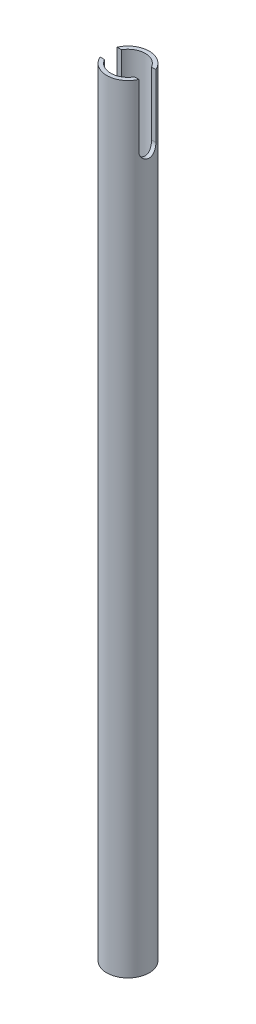
ISO-10303-21;
HEADER;
FILE_DESCRIPTION(('STEP AP214'),'2;1');
FILE_NAME('part.step','',(''),(''),'','','');
FILE_SCHEMA(('AUTOMOTIVE_DESIGN { 1 0 10303 214 1 1 1 1 }'));
ENDSEC;
DATA;
#1=APPLICATION_CONTEXT('core data for automotive mechanical design processes');
#2=APPLICATION_PROTOCOL_DEFINITION('international standard','automotive_design',2000,#1);
#3=PRODUCT_CONTEXT('',#1,'mechanical');
#4=PRODUCT('Part','Part','',(#3));
#5=PRODUCT_RELATED_PRODUCT_CATEGORY('part','',(#4));
#6=PRODUCT_DEFINITION_FORMATION('','',#4);
#7=PRODUCT_DEFINITION_CONTEXT('part definition',#1,'design');
#8=PRODUCT_DEFINITION('design','',#6,#7);
#9=PRODUCT_DEFINITION_SHAPE('','',#8);
#10=(LENGTH_UNIT() NAMED_UNIT(*) SI_UNIT(.MILLI.,.METRE.));
#11=(NAMED_UNIT(*) PLANE_ANGLE_UNIT() SI_UNIT($,.RADIAN.));
#12=(NAMED_UNIT(*) SI_UNIT($,.STERADIAN.) SOLID_ANGLE_UNIT());
#13=UNCERTAINTY_MEASURE_WITH_UNIT(LENGTH_MEASURE(1.E-05),#10,'distance_accuracy_value','');
#14=(GEOMETRIC_REPRESENTATION_CONTEXT(3) GLOBAL_UNCERTAINTY_ASSIGNED_CONTEXT((#13)) GLOBAL_UNIT_ASSIGNED_CONTEXT((#10,
#11,#12)) REPRESENTATION_CONTEXT('',''));
#15=CARTESIAN_POINT('',(0.,0.,0.));
#16=DIRECTION('',(0.,0.,1.));
#17=DIRECTION('',(1.,0.,0.));
#18=AXIS2_PLACEMENT_3D('',#15,#16,#17);
#19=CARTESIAN_POINT('',(0.,291.329005832087,3.17499999999999));
#20=DIRECTION('',(0.,1.,0.));
#21=DIRECTION('',(-1.,0.,0.));
#22=AXIS2_PLACEMENT_3D('',#19,#20,#21);
#23=PLANE('',#22);
#24=DIRECTION('',(-1.,0.,0.));
#25=VECTOR('',#24,1.);
#26=CARTESIAN_POINT('',(0.,291.329005832087,-3.17499999999999));
#27=LINE('',#26,#25);
#28=CARTESIAN_POINT('',(7.2748389157424,291.329005832087,-3.17499999999999));
#29=VERTEX_POINT('',#28);
#30=CARTESIAN_POINT('',(5.63085690548073,291.329005832087,-3.17499999999999));
#31=VERTEX_POINT('',#30);
#32=EDGE_CURVE('E170',#29,#31,#27,.T.);
#33=ORIENTED_EDGE('',*,*,#32,.F.);
#34=CARTESIAN_POINT('',(0.,291.329005832087,0.));
#35=DIRECTION('',(0.,1.,0.));
#36=DIRECTION('',(-1.,0.,0.));
#37=AXIS2_PLACEMENT_3D('',#34,#35,#36);
#38=CIRCLE('',#37,7.9375);
#39=CARTESIAN_POINT('',(-7.2748389157424,291.329005832087,-3.17499999999999));
#40=VERTEX_POINT('',#39);
#41=EDGE_CURVE('E211',#29,#40,#38,.T.);
#42=ORIENTED_EDGE('',*,*,#41,.T.);
#43=CARTESIAN_POINT('',(-5.63085690548073,291.329005832087,-3.17499999999999));
#44=VERTEX_POINT('',#43);
#45=EDGE_CURVE('E171',#44,#40,#27,.T.);
#46=ORIENTED_EDGE('',*,*,#45,.F.);
#47=CARTESIAN_POINT('',(0.,291.329005832087,0.));
#48=DIRECTION('',(0.,1.,0.));
#49=DIRECTION('',(-1.,0.,0.));
#50=AXIS2_PLACEMENT_3D('',#47,#48,#49);
#51=CIRCLE('',#50,6.4643);
#52=EDGE_CURVE('E207',#31,#44,#51,.T.);
#53=ORIENTED_EDGE('',*,*,#52,.F.);
#54=EDGE_LOOP('',(#33,#42,#46,#53));
#55=FACE_BOUND('',#54,.T.);
#56=ADVANCED_FACE('F36',(#55),#23,.T.);
#57=CARTESIAN_POINT('',(0.,339.17964613476,0.));
#58=DIRECTION('',(0.,-1.,0.));
#59=DIRECTION('',(0.,0.,-1.));
#60=AXIS2_PLACEMENT_3D('',#57,#58,#59);
#61=CYLINDRICAL_SURFACE('',#60,7.9375);
#62=CARTESIAN_POINT('',(0.,0.,0.));
#63=DIRECTION('',(0.,1.,0.));
#64=DIRECTION('',(0.,0.,1.));
#65=AXIS2_PLACEMENT_3D('',#62,#63,#64);
#66=CIRCLE('',#65,7.9375);
#67=CARTESIAN_POINT('',(0.,0.,7.9375));
#68=VERTEX_POINT('',#67);
#69=EDGE_CURVE('E208',#68,#68,#66,.T.);
#70=ORIENTED_EDGE('',*,*,#69,.T.);
#71=EDGE_LOOP('',(#70));
#72=FACE_BOUND('',#71,.T.);
#73=ORIENTED_EDGE('',*,*,#41,.F.);
#74=DIRECTION('',(0.,-1.,0.));
#75=VECTOR('',#74,1.);
#76=CARTESIAN_POINT('',(7.2748389157424,339.17964613476,-3.17499999999998));
#77=LINE('',#76,#75);
#78=CARTESIAN_POINT('',(7.2748389157424,267.691978033004,-3.175));
#79=VERTEX_POINT('',#78);
#80=EDGE_CURVE('E119',#29,#79,#77,.T.);
#81=ORIENTED_EDGE('',*,*,#80,.T.);
#82=CARTESIAN_POINT('',(7.2748389157424,267.691978033004,-3.175));
#83=CARTESIAN_POINT('',(7.27482137346731,267.606561242157,-3.17501266882701));
#84=CARTESIAN_POINT('',(7.2763428589775,267.521154038932,-3.17155340043564));
#85=CARTESIAN_POINT('',(7.2823328035035,267.351028597025,-3.15779000732846));
#86=CARTESIAN_POINT('',(7.28680014012066,267.266310108377,-3.14748848956708));
#87=CARTESIAN_POINT('',(7.29852780386515,267.09849620378,-3.12019320836237));
#88=CARTESIAN_POINT('',(7.30577708764083,267.015395718335,-3.10322589952438));
#89=CARTESIAN_POINT('',(7.32282084608483,266.851078057908,-3.06278962927674));
#90=CARTESIAN_POINT('',(7.3326154761132,266.769860998214,-3.03932027099634));
#91=CARTESIAN_POINT('',(7.36535374856868,266.530029870206,-2.95952817722212));
#92=CARTESIAN_POINT('',(7.39167700537415,266.374901941786,-2.89376627017734));
#93=CARTESIAN_POINT('',(7.45033388590046,266.077815049622,-2.7392025415261));
#94=CARTESIAN_POINT('',(7.48267321509131,265.935868780172,-2.65037881684982));
#95=CARTESIAN_POINT('',(7.55175336550835,265.66114897829,-2.4468428923214));
#96=CARTESIAN_POINT('',(7.588634899463,265.529220076165,-2.3310360096301));
#97=CARTESIAN_POINT('',(7.66147804996073,265.286057850849,-2.07914313305182));
#98=CARTESIAN_POINT('',(7.69743947634239,265.174828776426,-1.94305298619927));
#99=CARTESIAN_POINT('',(7.76610424655587,264.971945382301,-1.64783437907487));
#100=CARTESIAN_POINT('',(7.79862271461643,264.881238148614,-1.48800809365191));
#101=CARTESIAN_POINT('',(7.85501261299655,264.728363067298,-1.15383332747063));
#102=CARTESIAN_POINT('',(7.87888765130921,264.666183308653,-0.979490943577508));
#103=CARTESIAN_POINT('',(7.91429574508624,264.575173877037,-0.630185812820644));
#104=CARTESIAN_POINT('',(7.92637039529115,264.544875252503,-0.455661798193267));
#105=CARTESIAN_POINT('',(7.93877492459936,264.513757817031,-0.103613634211566));
#106=CARTESIAN_POINT('',(7.93910896442721,264.512928562519,0.0739094300030551));
#107=CARTESIAN_POINT('',(7.92832361516669,264.539969554444,0.416295487790175));
#108=CARTESIAN_POINT('',(7.91784651916131,264.566230346474,0.581309494992118));
#109=CARTESIAN_POINT('',(7.88748217026596,264.643967546574,0.904358712556958));
#110=CARTESIAN_POINT('',(7.86759438481231,264.695445381718,1.06239352740443));
#111=CARTESIAN_POINT('',(7.81997467816327,264.822788349732,1.36984988491622));
#112=CARTESIAN_POINT('',(7.7921290207194,264.899009439867,1.51910565802055));
#113=CARTESIAN_POINT('',(7.73135683541739,265.073339830064,1.80309420082015));
#114=CARTESIAN_POINT('',(7.69842852631223,265.17145680907,1.93782185081833));
#115=CARTESIAN_POINT('',(7.62828318752464,265.394303603316,2.19831250886755));
#116=CARTESIAN_POINT('',(7.59092651959626,265.520356745791,2.32290812422053));
#117=CARTESIAN_POINT('',(7.51779639956166,265.791697644384,2.54968017957911));
#118=CARTESIAN_POINT('',(7.48202367463434,265.9369941153,2.6518464058569));
#119=CARTESIAN_POINT('',(7.41514238501918,266.248143055038,2.83359604410578));
#120=CARTESIAN_POINT('',(7.38419755733311,266.414466546503,2.9124454400729));
#121=CARTESIAN_POINT('',(7.34535742834898,266.67300741989,3.00845526999255));
#122=CARTESIAN_POINT('',(7.3336755200429,266.760674228114,3.03674359852997));
#123=CARTESIAN_POINT('',(7.31322917691504,266.938439942827,3.08565852812915));
#124=CARTESIAN_POINT('',(7.30446343423192,267.028537739398,3.10628856431505));
#125=CARTESIAN_POINT('',(7.28994070197192,267.213702191436,3.14023004946565));
#126=CARTESIAN_POINT('',(7.2843027635288,267.30883121696,3.15325280299648));
#127=CARTESIAN_POINT('',(7.27673901487912,267.499961791552,3.17064531592315));
#128=CARTESIAN_POINT('',(7.2748109173123,267.595962766292,3.17502040721544));
#129=CARTESIAN_POINT('',(7.2748389157424,267.691978033004,3.175));
#130=B_SPLINE_CURVE_WITH_KNOTS('',3,(#82,#83,#84,#85,#86,#87,#88,#89,#90,#91,#92,#93,#94,#95,
#96,#97,#98,#99,#100,#101,#102,#103,#104,#105,#106,#107,#108,#109,#110,#111,#112,#113,#114,#115,
#116,#117,#118,#119,#120,#121,#122,#123,#124,#125,#126,#127,#128,#129),.UNSPECIFIED.,.F.,.F.,(4,
2,2,2,2,2,2,2,2,2,2,2,2,2,2,2,2,2,2,2,2,2,2,4),(0.,0.256150829294387,0.512204118914552,
0.767251309112325,1.02231407025902,1.53143426526075,2.04103977971416,2.57679901192849,
3.11266809105968,3.66971038544649,4.22651988700745,4.75637028950525,5.28603291779512,
5.78594402974508,6.28588343572724,6.79335980872481,7.30101443548666,7.8419622604596,
8.383155909604,8.93991483457339,9.21815697205879,9.49627415290111,9.78435582473146,
10.072259818324),.UNSPECIFIED.);
#131=CARTESIAN_POINT('',(7.27483891574239,267.691978033004,3.175));
#132=VERTEX_POINT('',#131);
#133=EDGE_CURVE('E118',#79,#132,#130,.T.);
#134=ORIENTED_EDGE('',*,*,#133,.T.);
#135=DIRECTION('',(0.,-1.,0.));
#136=VECTOR('',#135,1.);
#137=CARTESIAN_POINT('',(7.27483891574239,339.17964613476,3.17500000000002));
#138=LINE('',#137,#136);
#139=CARTESIAN_POINT('',(7.2748389157424,291.329005832087,3.17499999999999));
#140=VERTEX_POINT('',#139);
#141=EDGE_CURVE('E136',#132,#140,#138,.F.);
#142=ORIENTED_EDGE('',*,*,#141,.T.);
#143=CARTESIAN_POINT('',(-7.2748389157424,291.329005832087,3.17499999999999));
#144=VERTEX_POINT('',#143);
#145=EDGE_CURVE('E131',#144,#140,#38,.T.);
#146=ORIENTED_EDGE('',*,*,#145,.F.);
#147=DIRECTION('',(0.,-1.,0.));
#148=VECTOR('',#147,1.);
#149=CARTESIAN_POINT('',(-7.27483891574239,339.17964613476,3.17500000000002));
#150=LINE('',#149,#148);
#151=CARTESIAN_POINT('',(-7.27483891574239,267.691978033004,3.175));
#152=VERTEX_POINT('',#151);
#153=EDGE_CURVE('E58',#144,#152,#150,.T.);
#154=ORIENTED_EDGE('',*,*,#153,.T.);
#155=CARTESIAN_POINT('',(-7.2748389157424,267.691978033004,3.175));
#156=CARTESIAN_POINT('',(-7.2748213734673,267.606561242157,3.17501266882702));
#157=CARTESIAN_POINT('',(-7.2763428589775,267.521154038932,3.17155340043565));
#158=CARTESIAN_POINT('',(-7.2823328035035,267.351028597025,3.15779000732847));
#159=CARTESIAN_POINT('',(-7.28680014012065,267.266310108377,3.14748848956709));
#160=CARTESIAN_POINT('',(-7.29852780386515,267.09849620378,3.12019320836238));
#161=CARTESIAN_POINT('',(-7.30577708764083,267.015395718335,3.10322589952439));
#162=CARTESIAN_POINT('',(-7.32282084608482,266.851078057908,3.06278962927675));
#163=CARTESIAN_POINT('',(-7.3326154761132,266.769860998214,3.03932027099635));
#164=CARTESIAN_POINT('',(-7.36535374856867,266.530029870206,2.95952817722213));
#165=CARTESIAN_POINT('',(-7.39167700537415,266.374901941786,2.89376627017735));
#166=CARTESIAN_POINT('',(-7.45033388590046,266.077815049622,2.73920254152611));
#167=CARTESIAN_POINT('',(-7.48267321509131,265.935868780172,2.65037881684982));
#168=CARTESIAN_POINT('',(-7.55175336550835,265.66114897829,2.44684289232139));
#169=CARTESIAN_POINT('',(-7.588634899463,265.529220076165,2.3310360096301));
#170=CARTESIAN_POINT('',(-7.66147804996073,265.286057850849,2.07914313305181));
#171=CARTESIAN_POINT('',(-7.69743947634239,265.174828776426,1.94305298619926));
#172=CARTESIAN_POINT('',(-7.76610424655587,264.971945382301,1.64783437907488));
#173=CARTESIAN_POINT('',(-7.79862271461643,264.881238148614,1.48800809365192));
#174=CARTESIAN_POINT('',(-7.85501261299655,264.728363067298,1.15383332747064));
#175=CARTESIAN_POINT('',(-7.8788876513092,264.666183308653,0.979490943577513));
#176=CARTESIAN_POINT('',(-7.91429574508624,264.575173877037,0.630185812820647));
#177=CARTESIAN_POINT('',(-7.92637039529115,264.544875252503,0.455661798193267));
#178=CARTESIAN_POINT('',(-7.93877492459936,264.513757817031,0.103613634211562));
#179=CARTESIAN_POINT('',(-7.93910896442721,264.512928562519,-0.0739094300030618));
#180=CARTESIAN_POINT('',(-7.92832361516669,264.539969554444,-0.416295487790186));
#181=CARTESIAN_POINT('',(-7.91784651916131,264.566230346474,-0.581309494992131));
#182=CARTESIAN_POINT('',(-7.88748217026596,264.643967546574,-0.904358712556966));
#183=CARTESIAN_POINT('',(-7.86759438481231,264.695445381718,-1.06239352740444));
#184=CARTESIAN_POINT('',(-7.81997467816328,264.822788349732,-1.36984988491622));
#185=CARTESIAN_POINT('',(-7.7921290207194,264.899009439867,-1.51910565802054));
#186=CARTESIAN_POINT('',(-7.73135683541739,265.073339830064,-1.80309420082014));
#187=CARTESIAN_POINT('',(-7.69842852631223,265.17145680907,-1.93782185081832));
#188=CARTESIAN_POINT('',(-7.62828318752464,265.394303603316,-2.19831250886755));
#189=CARTESIAN_POINT('',(-7.59092651959626,265.520356745791,-2.32290812422053));
#190=CARTESIAN_POINT('',(-7.51779639956166,265.791697644384,-2.5496801795791));
#191=CARTESIAN_POINT('',(-7.48202367463434,265.9369941153,-2.6518464058569));
#192=CARTESIAN_POINT('',(-7.41514238501918,266.248143055038,-2.83359604410577));
#193=CARTESIAN_POINT('',(-7.38419755733311,266.414466546503,-2.9124454400729));
#194=CARTESIAN_POINT('',(-7.34535742834898,266.67300741989,-3.00845526999254));
#195=CARTESIAN_POINT('',(-7.3336755200429,266.760674228114,-3.03674359852997));
#196=CARTESIAN_POINT('',(-7.31322917691504,266.938439942827,-3.08565852812915));
#197=CARTESIAN_POINT('',(-7.30446343423192,267.028537739398,-3.10628856431504));
#198=CARTESIAN_POINT('',(-7.28994070197193,267.213702191436,-3.14023004946564));
#199=CARTESIAN_POINT('',(-7.2843027635288,267.30883121696,-3.15325280299647));
#200=CARTESIAN_POINT('',(-7.27673901487912,267.499961791552,-3.17064531592314));
#201=CARTESIAN_POINT('',(-7.2748109173123,267.595962766292,-3.17502040721544));
#202=CARTESIAN_POINT('',(-7.2748389157424,267.691978033004,-3.175));
#203=B_SPLINE_CURVE_WITH_KNOTS('',3,(#155,#156,#157,#158,#159,#160,#161,#162,#163,#164,#165,
#166,#167,#168,#169,#170,#171,#172,#173,#174,#175,#176,#177,#178,#179,#180,#181,#182,#183,#184,
#185,#186,#187,#188,#189,#190,#191,#192,#193,#194,#195,#196,#197,#198,#199,#200,#201,#202),
.UNSPECIFIED.,.F.,.F.,(4,2,2,2,2,2,2,2,2,2,2,2,2,2,2,2,2,2,2,2,2,2,2,4),(0.,0.256150829294387,
0.512204118914552,0.767251309112325,1.02231407025902,1.53143426526075,2.04103977971416,
2.57679901192855,3.11266809105968,3.66971038544649,4.22651988700746,4.75637028950526,
5.28603291779514,5.78594402974511,6.28588343572724,6.79335980872481,7.30101443548666,
7.8419622604596,8.383155909604,8.93991483457339,9.21815697205879,9.49627415290111,
9.78435582473146,10.072259818324),.UNSPECIFIED.);
#204=CARTESIAN_POINT('',(-7.2748389157424,267.691978033004,-3.175));
#205=VERTEX_POINT('',#204);
#206=EDGE_CURVE('E109',#152,#205,#203,.T.);
#207=ORIENTED_EDGE('',*,*,#206,.T.);
#208=DIRECTION('',(0.,-1.,0.));
#209=VECTOR('',#208,1.);
#210=CARTESIAN_POINT('',(-7.2748389157424,339.17964613476,-3.17499999999998));
#211=LINE('',#210,#209);
#212=EDGE_CURVE('E134',#205,#40,#211,.F.);
#213=ORIENTED_EDGE('',*,*,#212,.T.);
#214=EDGE_LOOP('',(#73,#81,#134,#142,#146,#154,#207,#213));
#215=FACE_BOUND('',#214,.T.);
#216=ADVANCED_FACE('F38',(#72,#215),#61,.T.);
#217=CARTESIAN_POINT('',(0.,0.,0.));
#218=DIRECTION('',(0.,1.,0.));
#219=DIRECTION('',(0.,0.,1.));
#220=AXIS2_PLACEMENT_3D('',#217,#218,#219);
#221=PLANE('',#220);
#222=ORIENTED_EDGE('',*,*,#69,.F.);
#223=EDGE_LOOP('',(#222));
#224=FACE_BOUND('',#223,.T.);
#225=CARTESIAN_POINT('',(0.,0.,0.));
#226=DIRECTION('',(0.,1.,0.));
#227=DIRECTION('',(0.,0.,1.));
#228=AXIS2_PLACEMENT_3D('',#225,#226,#227);
#229=CIRCLE('',#228,6.4643);
#230=CARTESIAN_POINT('',(0.,0.,6.4643));
#231=VERTEX_POINT('',#230);
#232=EDGE_CURVE('E206',#231,#231,#229,.T.);
#233=ORIENTED_EDGE('',*,*,#232,.T.);
#234=EDGE_LOOP('',(#233));
#235=FACE_BOUND('',#234,.T.);
#236=ADVANCED_FACE('F177',(#224,#235),#221,.F.);
#237=CARTESIAN_POINT('',(0.,339.17964613476,0.));
#238=DIRECTION('',(0.,-1.,0.));
#239=DIRECTION('',(0.,0.,-1.));
#240=AXIS2_PLACEMENT_3D('',#237,#238,#239);
#241=CYLINDRICAL_SURFACE('',#240,6.4643);
#242=DIRECTION('',(0.,-1.,0.));
#243=VECTOR('',#242,1.);
#244=CARTESIAN_POINT('',(-5.63085690548074,339.17964613476,-3.17499999999998));
#245=LINE('',#244,#243);
#246=CARTESIAN_POINT('',(-5.63085690548073,267.691978033004,-3.175));
#247=VERTEX_POINT('',#246);
#248=EDGE_CURVE('E132',#247,#44,#245,.F.);
#249=ORIENTED_EDGE('',*,*,#248,.F.);
#250=CARTESIAN_POINT('',(-5.63085690548073,267.691978033004,3.175));
#251=CARTESIAN_POINT('',(-5.63083314427865,267.608604688373,3.17501475658537));
#252=CARTESIAN_POINT('',(-5.63270800290612,267.525244504281,3.17171650894932));
#253=CARTESIAN_POINT('',(-5.64007619078876,267.359246244162,3.15861005673363));
#254=CARTESIAN_POINT('',(-5.64556738634361,267.276607771427,3.14880569084843));
#255=CARTESIAN_POINT('',(-5.65994981136479,267.113104282406,3.12287502503968));
#256=CARTESIAN_POINT('',(-5.66882198481542,267.032231964783,3.10678414485082));
#257=CARTESIAN_POINT('',(-5.68964152520503,266.872367708,3.06848950606601));
#258=CARTESIAN_POINT('',(-5.70158922758274,266.793375974976,3.04628508066559));
#259=CARTESIAN_POINT('',(-5.74141923049072,266.560311176745,2.97094683956398));
#260=CARTESIAN_POINT('',(-5.77333408209964,266.409671547362,2.9090108202004));
#261=CARTESIAN_POINT('',(-5.84425924105451,266.120816978303,2.76375069900003));
#262=CARTESIAN_POINT('',(-5.8832801090714,265.98262099491,2.68039468681891));
#263=CARTESIAN_POINT('',(-5.96775511660967,265.710680217436,2.48697633404428));
#264=CARTESIAN_POINT('',(-6.01347388807208,265.578143182901,2.37532770540396));
#265=CARTESIAN_POINT('',(-6.10404750316967,265.33276842569,2.13181920715592));
#266=CARTESIAN_POINT('',(-6.1489021156932,265.219935909491,1.99995401300493));
#267=CARTESIAN_POINT('',(-6.23617179606458,265.010002833209,1.70932187954952));
#268=CARTESIAN_POINT('',(-6.27824209999684,264.914389366207,1.54936740140359));
#269=CARTESIAN_POINT('',(-6.35176072116115,264.75198213415,1.21319061658813));
#270=CARTESIAN_POINT('',(-6.38321544776103,264.68517097234,1.03697820811137));
#271=CARTESIAN_POINT('',(-6.43004158193837,264.587044926957,0.686188092188342));
#272=CARTESIAN_POINT('',(-6.4463738522475,264.55359694204,0.512338218857005));
#273=CARTESIAN_POINT('',(-6.46469144763397,264.516136353527,0.160782019690507));
#274=CARTESIAN_POINT('',(-6.46668486855406,264.512107139809,-0.0169220731568658));
#275=CARTESIAN_POINT('',(-6.45656772214049,264.532742937696,-0.355165464690631));
#276=CARTESIAN_POINT('',(-6.44562758639317,264.555026548482,-0.515892945153654));
#277=CARTESIAN_POINT('',(-6.41262380355029,264.623413354821,-0.830980900255621));
#278=CARTESIAN_POINT('',(-6.39055953953696,264.66951787143,-0.985341021262242));
#279=CARTESIAN_POINT('',(-6.33694807701977,264.784577114457,-1.28605792480313));
#280=CARTESIAN_POINT('',(-6.30527071175889,264.853846915491,-1.43226999332137));
#281=CARTESIAN_POINT('',(-6.23531544865735,265.012854101295,-1.71135796541491));
#282=CARTESIAN_POINT('',(-6.19703506227319,265.102599206918,-1.84422881097799));
#283=CARTESIAN_POINT('',(-6.11334024943196,265.309515104003,-2.10589815284401));
#284=CARTESIAN_POINT('',(-6.06759349912715,265.428449140224,-2.23319819913489));
#285=CARTESIAN_POINT('',(-5.97642079952694,265.685602651658,-2.46684622430578));
#286=CARTESIAN_POINT('',(-5.93099515323759,265.823838302897,-2.57317644688652));
#287=CARTESIAN_POINT('',(-5.84266284464015,266.126041130414,-2.76814528378424));
#288=CARTESIAN_POINT('',(-5.80007313328349,266.291057149468,-2.85533090866606));
#289=CARTESIAN_POINT('',(-5.74498523796176,266.549433967913,-2.96377401450739));
#290=CARTESIAN_POINT('',(-5.72809486991884,266.637322455872,-2.99618869442095));
#291=CARTESIAN_POINT('',(-5.69788122082072,266.816159142456,-3.05325494421089));
#292=CARTESIAN_POINT('',(-5.68455638707004,266.90710598976,-3.07790989407045));
#293=CARTESIAN_POINT('',(-5.65951648210793,267.112223425745,-3.12376274190011));
#294=CARTESIAN_POINT('',(-5.64884707083827,267.226994391041,-3.14291763203007));
#295=CARTESIAN_POINT('',(-5.63809564796983,267.400547497552,-3.16213513069618));
#296=CARTESIAN_POINT('',(-5.63538722073203,267.458687370918,-3.16695519983111));
#297=CARTESIAN_POINT('',(-5.63176603795252,267.575205002151,-3.17338827752117));
#298=CARTESIAN_POINT('',(-5.63085344341391,267.633582780875,-3.17500099852573));
#299=CARTESIAN_POINT('',(-5.63085690548073,267.691978033004,-3.175));
#300=B_SPLINE_CURVE_WITH_KNOTS('',3,(#250,#251,#252,#253,#254,#255,#256,#257,#258,#259,#260,
#261,#262,#263,#264,#265,#266,#267,#268,#269,#270,#271,#272,#273,#274,#275,#276,#277,#278,#279,
#280,#281,#282,#283,#284,#285,#286,#287,#288,#289,#290,#291,#292,#293,#294,#295,#296,#297,#298,
#299),.UNSPECIFIED.,.F.,.F.,(4,2,2,2,2,2,2,2,2,2,2,2,2,2,2,2,2,2,2,2,2,2,2,2,4),(0.,
0.250012145988229,0.499876912554615,0.748353725112907,0.996857649784888,1.4924278441344,
1.98874063593385,2.52414179614751,3.05968421079767,3.62982161542683,4.19961416973237,
4.73004882970632,5.26018397799674,5.74579693142524,6.23143681875924,6.72397049630925,
7.2166902069248,7.75472587709895,8.29321519372077,8.86416763704419,9.14936329782647,
9.43443456060701,9.78397951274084,9.95908597830923,10.1342081421097),.UNSPECIFIED.);
#301=CARTESIAN_POINT('',(-5.63085690548072,267.691978033004,3.175));
#302=VERTEX_POINT('',#301);
#303=EDGE_CURVE('E12',#302,#247,#300,.T.);
#304=ORIENTED_EDGE('',*,*,#303,.F.);
#305=DIRECTION('',(0.,-1.,0.));
#306=VECTOR('',#305,1.);
#307=CARTESIAN_POINT('',(-5.63085690548072,339.17964613476,3.17500000000002));
#308=LINE('',#307,#306);
#309=CARTESIAN_POINT('',(-5.63085690548073,291.329005832087,3.17499999999999));
#310=VERTEX_POINT('',#309);
#311=EDGE_CURVE('E123',#310,#302,#308,.T.);
#312=ORIENTED_EDGE('',*,*,#311,.F.);
#313=CARTESIAN_POINT('',(5.63085690548073,291.329005832087,3.17499999999999));
#314=VERTEX_POINT('',#313);
#315=EDGE_CURVE('E202',#310,#314,#51,.T.);
#316=ORIENTED_EDGE('',*,*,#315,.T.);
#317=DIRECTION('',(0.,-1.,0.));
#318=VECTOR('',#317,1.);
#319=CARTESIAN_POINT('',(5.63085690548072,339.17964613476,3.17500000000002));
#320=LINE('',#319,#318);
#321=CARTESIAN_POINT('',(5.63085690548072,267.691978033004,3.175));
#322=VERTEX_POINT('',#321);
#323=EDGE_CURVE('E66',#322,#314,#320,.F.);
#324=ORIENTED_EDGE('',*,*,#323,.F.);
#325=CARTESIAN_POINT('',(5.63085690548073,267.691978033004,-3.175));
#326=CARTESIAN_POINT('',(5.63083314427865,267.608604688373,-3.17501475658537));
#327=CARTESIAN_POINT('',(5.63270800290613,267.525244504281,-3.17171650894932));
#328=CARTESIAN_POINT('',(5.64007619078876,267.359246244162,-3.15861005673362));
#329=CARTESIAN_POINT('',(5.64556738634361,267.276607771427,-3.14880569084842));
#330=CARTESIAN_POINT('',(5.65994981136479,267.113104282406,-3.12287502503967));
#331=CARTESIAN_POINT('',(5.66882198481542,267.032231964783,-3.10678414485081));
#332=CARTESIAN_POINT('',(5.68964152520503,266.872367708,-3.06848950606601));
#333=CARTESIAN_POINT('',(5.70158922758275,266.793375974976,-3.04628508066559));
#334=CARTESIAN_POINT('',(5.74141923049072,266.560311176745,-2.97094683956398));
#335=CARTESIAN_POINT('',(5.77333408209964,266.409671547362,-2.9090108202004));
#336=CARTESIAN_POINT('',(5.84425924105452,266.120816978303,-2.76375069900002));
#337=CARTESIAN_POINT('',(5.88328010907141,265.98262099491,-2.6803946868189));
#338=CARTESIAN_POINT('',(5.96775511660967,265.710680217436,-2.48697633404427));
#339=CARTESIAN_POINT('',(6.01347388807208,265.578143182901,-2.37532770540396));
#340=CARTESIAN_POINT('',(6.10404750316967,265.33276842569,-2.13181920715592));
#341=CARTESIAN_POINT('',(6.1489021156932,265.219935909491,-1.99995401300493));
#342=CARTESIAN_POINT('',(6.23617179606458,265.010002833209,-1.70932187954951));
#343=CARTESIAN_POINT('',(6.27824209999685,264.914389366207,-1.54936740140358));
#344=CARTESIAN_POINT('',(6.35176072116115,264.75198213415,-1.21319061658812));
#345=CARTESIAN_POINT('',(6.38321544776104,264.68517097234,-1.03697820811136));
#346=CARTESIAN_POINT('',(6.43004158193837,264.587044926957,-0.686188092188336));
#347=CARTESIAN_POINT('',(6.4463738522475,264.55359694204,-0.512338218857));
#348=CARTESIAN_POINT('',(6.46469144763397,264.516136353527,-0.160782019690502));
#349=CARTESIAN_POINT('',(6.46668486855406,264.512107139809,0.0169220731568713));
#350=CARTESIAN_POINT('',(6.45656772214049,264.532742937696,0.355165464690636));
#351=CARTESIAN_POINT('',(6.44562758639317,264.555026548482,0.51589294515366));
#352=CARTESIAN_POINT('',(6.41262380355029,264.623413354821,0.830980900255626));
#353=CARTESIAN_POINT('',(6.39055953953696,264.66951787143,0.985341021262247));
#354=CARTESIAN_POINT('',(6.33694807701977,264.784577114457,1.28605792480314));
#355=CARTESIAN_POINT('',(6.30527071175889,264.853846915491,1.43226999332138));
#356=CARTESIAN_POINT('',(6.23531544865734,265.012854101295,1.71135796541492));
#357=CARTESIAN_POINT('',(6.19703506227319,265.102599206918,1.844228810978));
#358=CARTESIAN_POINT('',(6.11334024943196,265.309515104003,2.10589815284401));
#359=CARTESIAN_POINT('',(6.06759349912715,265.428449140224,2.23319819913489));
#360=CARTESIAN_POINT('',(5.97642079952693,265.685602651658,2.46684622430579));
#361=CARTESIAN_POINT('',(5.93099515323759,265.823838302897,2.57317644688653));
#362=CARTESIAN_POINT('',(5.84266284464015,266.126041130414,2.76814528378424));
#363=CARTESIAN_POINT('',(5.80007313328348,266.291057149468,2.85533090866607));
#364=CARTESIAN_POINT('',(5.74498523796176,266.549433967913,2.96377401450739));
#365=CARTESIAN_POINT('',(5.72809486991883,266.637322455872,2.99618869442096));
#366=CARTESIAN_POINT('',(5.69788122082071,266.816159142456,3.0532549442109));
#367=CARTESIAN_POINT('',(5.68455638707004,266.90710598976,3.07790989407046));
#368=CARTESIAN_POINT('',(5.65951648210793,267.112223425745,3.12376274190011));
#369=CARTESIAN_POINT('',(5.64884707083826,267.226994391041,3.14291763203007));
#370=CARTESIAN_POINT('',(5.63809564796983,267.400547497552,3.16213513069618));
#371=CARTESIAN_POINT('',(5.63538722073202,267.458687370918,3.16695519983111));
#372=CARTESIAN_POINT('',(5.63176603795252,267.575205002151,3.17338827752118));
#373=CARTESIAN_POINT('',(5.63085344341391,267.633582780875,3.17500099852574));
#374=CARTESIAN_POINT('',(5.63085690548073,267.691978033004,3.175));
#375=B_SPLINE_CURVE_WITH_KNOTS('',3,(#325,#326,#327,#328,#329,#330,#331,#332,#333,#334,#335,
#336,#337,#338,#339,#340,#341,#342,#343,#344,#345,#346,#347,#348,#349,#350,#351,#352,#353,#354,
#355,#356,#357,#358,#359,#360,#361,#362,#363,#364,#365,#366,#367,#368,#369,#370,#371,#372,#373,
#374),.UNSPECIFIED.,.F.,.F.,(4,2,2,2,2,2,2,2,2,2,2,2,2,2,2,2,2,2,2,2,2,2,2,2,4),(0.,
0.250012145988229,0.499876912554615,0.748353725112907,0.996857649784888,1.4924278441344,
1.98874063593385,2.52414179614751,3.05968421079767,3.62982161542682,4.19961416973237,
4.73004882970632,5.26018397799673,5.74579693142524,6.23143681875924,6.72397049630925,
7.2166902069248,7.75472587709895,8.29321519372077,8.86416763704419,9.14936329782647,
9.434434560607,9.78397951274084,9.95908597830922,10.1342081421097),.UNSPECIFIED.);
#376=CARTESIAN_POINT('',(5.63085690548073,267.691978033004,-3.175));
#377=VERTEX_POINT('',#376);
#378=EDGE_CURVE('E51',#377,#322,#375,.T.);
#379=ORIENTED_EDGE('',*,*,#378,.F.);
#380=DIRECTION('',(0.,-1.,0.));
#381=VECTOR('',#380,1.);
#382=CARTESIAN_POINT('',(5.63085690548074,339.17964613476,-3.17499999999998));
#383=LINE('',#382,#381);
#384=EDGE_CURVE('E141',#31,#377,#383,.T.);
#385=ORIENTED_EDGE('',*,*,#384,.F.);
#386=ORIENTED_EDGE('',*,*,#52,.T.);
#387=EDGE_LOOP('',(#249,#304,#312,#316,#324,#379,#385,#386));
#388=FACE_BOUND('',#387,.T.);
#389=ORIENTED_EDGE('',*,*,#232,.F.);
#390=EDGE_LOOP('',(#389));
#391=FACE_BOUND('',#390,.T.);
#392=ADVANCED_FACE('F173',(#388,#391),#241,.F.);
#393=DIRECTION('',(1.,0.,0.));
#394=VECTOR('',#393,1.);
#395=CARTESIAN_POINT('',(0.,291.329005832087,3.17499999999999));
#396=LINE('',#395,#394);
#397=EDGE_CURVE('E200',#144,#310,#396,.T.);
#398=ORIENTED_EDGE('',*,*,#397,.F.);
#399=ORIENTED_EDGE('',*,*,#145,.T.);
#400=EDGE_CURVE('E203',#314,#140,#396,.T.);
#401=ORIENTED_EDGE('',*,*,#400,.F.);
#402=ORIENTED_EDGE('',*,*,#315,.F.);
#403=EDGE_LOOP('',(#398,#399,#401,#402));
#404=FACE_BOUND('',#403,.T.);
#405=ADVANCED_FACE('F176',(#404),#23,.T.);
#406=CARTESIAN_POINT('',(-7.9375,318.491978033004,3.17500000000001));
#407=DIRECTION('',(0.,0.,1.));
#408=DIRECTION('',(0.,-1.,0.));
#409=AXIS2_PLACEMENT_3D('',#406,#407,#408);
#410=PLANE('',#409);
#411=DIRECTION('',(1.,0.,0.));
#412=VECTOR('',#411,1.);
#413=CARTESIAN_POINT('',(-7.9375,267.691978033004,3.175));
#414=LINE('',#413,#412);
#415=EDGE_CURVE('E125',#322,#132,#414,.T.);
#416=ORIENTED_EDGE('',*,*,#415,.F.);
#417=ORIENTED_EDGE('',*,*,#323,.T.);
#418=ORIENTED_EDGE('',*,*,#400,.T.);
#419=ORIENTED_EDGE('',*,*,#141,.F.);
#420=EDGE_LOOP('',(#416,#417,#418,#419));
#421=FACE_BOUND('',#420,.T.);
#422=ADVANCED_FACE('F194',(#421),#410,.F.);
#423=CARTESIAN_POINT('',(-7.9375,318.491978033004,-3.17499999999999));
#424=DIRECTION('',(0.,0.,-1.));
#425=DIRECTION('',(0.,1.,0.));
#426=AXIS2_PLACEMENT_3D('',#423,#424,#425);
#427=PLANE('',#426);
#428=ORIENTED_EDGE('',*,*,#32,.T.);
#429=ORIENTED_EDGE('',*,*,#384,.T.);
#430=DIRECTION('',(1.,0.,0.));
#431=VECTOR('',#430,1.);
#432=CARTESIAN_POINT('',(-7.9375,267.691978033004,-3.175));
#433=LINE('',#432,#431);
#434=EDGE_CURVE('E124',#377,#79,#433,.T.);
#435=ORIENTED_EDGE('',*,*,#434,.T.);
#436=ORIENTED_EDGE('',*,*,#80,.F.);
#437=EDGE_LOOP('',(#428,#429,#435,#436));
#438=FACE_BOUND('',#437,.T.);
#439=ADVANCED_FACE('F159',(#438),#427,.F.);
#440=CARTESIAN_POINT('',(-7.9375,267.691978033004,0.));
#441=DIRECTION('',(1.,0.,0.));
#442=DIRECTION('',(0.,0.,-1.));
#443=AXIS2_PLACEMENT_3D('',#440,#441,#442);
#444=CYLINDRICAL_SURFACE('',#443,3.175);
#445=ORIENTED_EDGE('',*,*,#434,.F.);
#446=ORIENTED_EDGE('',*,*,#378,.T.);
#447=ORIENTED_EDGE('',*,*,#415,.T.);
#448=ORIENTED_EDGE('',*,*,#133,.F.);
#449=EDGE_LOOP('',(#445,#446,#447,#448));
#450=FACE_BOUND('',#449,.T.);
#451=ADVANCED_FACE('F154',(#450),#444,.F.);
#452=EDGE_CURVE('E111',#152,#302,#414,.T.);
#453=ORIENTED_EDGE('',*,*,#452,.T.);
#454=ORIENTED_EDGE('',*,*,#303,.T.);
#455=EDGE_CURVE('E114',#205,#247,#433,.T.);
#456=ORIENTED_EDGE('',*,*,#455,.F.);
#457=ORIENTED_EDGE('',*,*,#206,.F.);
#458=EDGE_LOOP('',(#453,#454,#456,#457));
#459=FACE_BOUND('',#458,.T.);
#460=ADVANCED_FACE('F110',(#459),#444,.F.);
#461=ORIENTED_EDGE('',*,*,#455,.T.);
#462=ORIENTED_EDGE('',*,*,#248,.T.);
#463=ORIENTED_EDGE('',*,*,#45,.T.);
#464=ORIENTED_EDGE('',*,*,#212,.F.);
#465=EDGE_LOOP('',(#461,#462,#463,#464));
#466=FACE_BOUND('',#465,.T.);
#467=ADVANCED_FACE('F218',(#466),#427,.F.);
#468=ORIENTED_EDGE('',*,*,#397,.T.);
#469=ORIENTED_EDGE('',*,*,#311,.T.);
#470=ORIENTED_EDGE('',*,*,#452,.F.);
#471=ORIENTED_EDGE('',*,*,#153,.F.);
#472=EDGE_LOOP('',(#468,#469,#470,#471));
#473=FACE_BOUND('',#472,.T.);
#474=ADVANCED_FACE('F121',(#473),#410,.F.);
#475=CLOSED_SHELL('',(#56,#216,#236,#392,#405,#422,#439,#451,#460,#467,#474));
#476=MANIFOLD_SOLID_BREP('B2',#475);
#477=ADVANCED_BREP_SHAPE_REPRESENTATION('',(#18,#476),#14);
#478=SHAPE_DEFINITION_REPRESENTATION(#9,#477);
ENDSEC;
END-ISO-10303-21;
